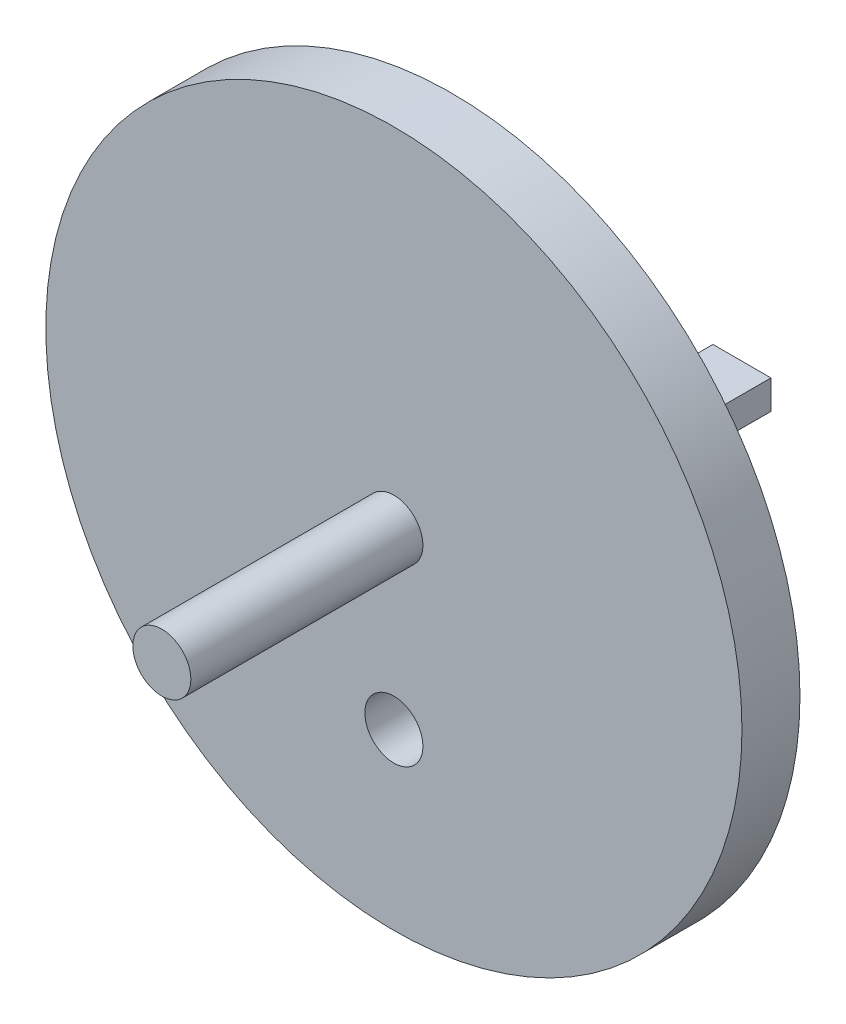
ISO-10303-21;
HEADER;
FILE_DESCRIPTION(('STEP AP214'),'2;1');
FILE_NAME('part.step','',(''),(''),'','','');
FILE_SCHEMA(('AUTOMOTIVE_DESIGN { 1 0 10303 214 1 1 1 1 }'));
ENDSEC;
DATA;
#1=APPLICATION_CONTEXT('core data for automotive mechanical design processes');
#2=APPLICATION_PROTOCOL_DEFINITION('international standard','automotive_design',2000,#1);
#3=PRODUCT_CONTEXT('',#1,'mechanical');
#4=PRODUCT('Part','Part','',(#3));
#5=PRODUCT_RELATED_PRODUCT_CATEGORY('part','',(#4));
#6=PRODUCT_DEFINITION_FORMATION('','',#4);
#7=PRODUCT_DEFINITION_CONTEXT('part definition',#1,'design');
#8=PRODUCT_DEFINITION('design','',#6,#7);
#9=PRODUCT_DEFINITION_SHAPE('','',#8);
#10=(LENGTH_UNIT() NAMED_UNIT(*) SI_UNIT(.MILLI.,.METRE.));
#11=(NAMED_UNIT(*) PLANE_ANGLE_UNIT() SI_UNIT($,.RADIAN.));
#12=(NAMED_UNIT(*) SI_UNIT($,.STERADIAN.) SOLID_ANGLE_UNIT());
#13=UNCERTAINTY_MEASURE_WITH_UNIT(LENGTH_MEASURE(1.E-05),#10,'distance_accuracy_value','');
#14=(GEOMETRIC_REPRESENTATION_CONTEXT(3) GLOBAL_UNCERTAINTY_ASSIGNED_CONTEXT((#13)) GLOBAL_UNIT_ASSIGNED_CONTEXT((#10,
#11,#12)) REPRESENTATION_CONTEXT('',''));
#15=CARTESIAN_POINT('',(0.,0.,0.));
#16=DIRECTION('',(0.,0.,1.));
#17=DIRECTION('',(1.,0.,0.));
#18=AXIS2_PLACEMENT_3D('',#15,#16,#17);
#19=CARTESIAN_POINT('',(0.,0.,0.));
#20=DIRECTION('',(0.,0.,1.));
#21=DIRECTION('',(1.,0.,0.));
#22=AXIS2_PLACEMENT_3D('',#19,#20,#21);
#23=PLANE('',#22);
#24=DIRECTION('',(0.,-1.,0.));
#25=VECTOR('',#24,1.);
#26=CARTESIAN_POINT('',(45.,35.,0.));
#27=LINE('',#26,#25);
#28=CARTESIAN_POINT('',(45.,35.,0.));
#29=VERTEX_POINT('',#28);
#30=CARTESIAN_POINT('',(45.,30.,0.));
#31=VERTEX_POINT('',#30);
#32=EDGE_CURVE('E123',#29,#31,#27,.T.);
#33=ORIENTED_EDGE('',*,*,#32,.F.);
#34=DIRECTION('',(1.,0.,0.));
#35=VECTOR('',#34,1.);
#36=CARTESIAN_POINT('',(45.,35.,0.));
#37=LINE('',#36,#35);
#38=CARTESIAN_POINT('',(35.,35.,0.));
#39=VERTEX_POINT('',#38);
#40=EDGE_CURVE('E136',#39,#29,#37,.T.);
#41=ORIENTED_EDGE('',*,*,#40,.F.);
#42=DIRECTION('',(0.,1.,0.));
#43=VECTOR('',#42,1.);
#44=CARTESIAN_POINT('',(35.,35.,0.));
#45=LINE('',#44,#43);
#46=CARTESIAN_POINT('',(35.,30.,0.));
#47=VERTEX_POINT('',#46);
#48=EDGE_CURVE('E145',#47,#39,#45,.T.);
#49=ORIENTED_EDGE('',*,*,#48,.F.);
#50=DIRECTION('',(-1.,0.,0.));
#51=VECTOR('',#50,1.);
#52=CARTESIAN_POINT('',(45.,30.,0.));
#53=LINE('',#52,#51);
#54=EDGE_CURVE('E126',#31,#47,#53,.T.);
#55=ORIENTED_EDGE('',*,*,#54,.F.);
#56=EDGE_LOOP('',(#33,#41,#49,#55));
#57=FACE_BOUND('',#56,.T.);
#58=CARTESIAN_POINT('',(0.,-30.,0.));
#59=DIRECTION('',(0.,0.,-1.));
#60=DIRECTION('',(-1.,0.,0.));
#61=AXIS2_PLACEMENT_3D('',#58,#59,#60);
#62=CIRCLE('',#61,5.);
#63=CARTESIAN_POINT('',(-5.00000000000001,-30.,0.));
#64=VERTEX_POINT('',#63);
#65=EDGE_CURVE('E161',#64,#64,#62,.T.);
#66=ORIENTED_EDGE('',*,*,#65,.F.);
#67=EDGE_LOOP('',(#66));
#68=FACE_BOUND('',#67,.T.);
#69=CARTESIAN_POINT('',(0.,0.,0.));
#70=DIRECTION('',(0.,0.,1.));
#71=DIRECTION('',(1.,0.,0.));
#72=AXIS2_PLACEMENT_3D('',#69,#70,#71);
#73=CIRCLE('',#72,60.);
#74=CARTESIAN_POINT('',(60.,0.,0.));
#75=VERTEX_POINT('',#74);
#76=EDGE_CURVE('E41',#75,#75,#73,.T.);
#77=ORIENTED_EDGE('',*,*,#76,.F.);
#78=EDGE_LOOP('',(#77));
#79=FACE_BOUND('',#78,.T.);
#80=DIRECTION('',(1.,0.,0.));
#81=VECTOR('',#80,1.);
#82=CARTESIAN_POINT('',(-45.,35.,0.));
#83=LINE('',#82,#81);
#84=CARTESIAN_POINT('',(-45.,35.,0.));
#85=VERTEX_POINT('',#84);
#86=CARTESIAN_POINT('',(-35.,35.,0.));
#87=VERTEX_POINT('',#86);
#88=EDGE_CURVE('E122',#85,#87,#83,.T.);
#89=ORIENTED_EDGE('',*,*,#88,.F.);
#90=DIRECTION('',(0.,1.,0.));
#91=VECTOR('',#90,1.);
#92=CARTESIAN_POINT('',(-45.,35.,0.));
#93=LINE('',#92,#91);
#94=CARTESIAN_POINT('',(-45.,30.,0.));
#95=VERTEX_POINT('',#94);
#96=EDGE_CURVE('E119',#95,#85,#93,.T.);
#97=ORIENTED_EDGE('',*,*,#96,.F.);
#98=DIRECTION('',(-1.,0.,0.));
#99=VECTOR('',#98,1.);
#100=CARTESIAN_POINT('',(-45.,30.,0.));
#101=LINE('',#100,#99);
#102=CARTESIAN_POINT('',(-35.,30.,0.));
#103=VERTEX_POINT('',#102);
#104=EDGE_CURVE('E57',#103,#95,#101,.T.);
#105=ORIENTED_EDGE('',*,*,#104,.F.);
#106=DIRECTION('',(0.,-1.,0.));
#107=VECTOR('',#106,1.);
#108=CARTESIAN_POINT('',(-35.,35.,0.));
#109=LINE('',#108,#107);
#110=EDGE_CURVE('E52',#87,#103,#109,.T.);
#111=ORIENTED_EDGE('',*,*,#110,.F.);
#112=EDGE_LOOP('',(#89,#97,#105,#111));
#113=FACE_BOUND('',#112,.T.);
#114=ADVANCED_FACE('F37',(#57,#68,#79,#113),#23,.F.);
#115=CARTESIAN_POINT('',(0.,0.,10.));
#116=DIRECTION('',(0.,0.,1.));
#117=DIRECTION('',(1.,0.,0.));
#118=AXIS2_PLACEMENT_3D('',#115,#116,#117);
#119=PLANE('',#118);
#120=CARTESIAN_POINT('',(0.,-30.,10.));
#121=DIRECTION('',(0.,0.,-1.));
#122=DIRECTION('',(-1.,0.,0.));
#123=AXIS2_PLACEMENT_3D('',#120,#121,#122);
#124=CIRCLE('',#123,5.);
#125=CARTESIAN_POINT('',(-5.00000000000001,-30.,10.));
#126=VERTEX_POINT('',#125);
#127=EDGE_CURVE('E162',#126,#126,#124,.T.);
#128=ORIENTED_EDGE('',*,*,#127,.T.);
#129=EDGE_LOOP('',(#128));
#130=FACE_BOUND('',#129,.T.);
#131=CARTESIAN_POINT('',(0.,0.,10.));
#132=DIRECTION('',(0.,0.,1.));
#133=DIRECTION('',(1.,0.,0.));
#134=AXIS2_PLACEMENT_3D('',#131,#132,#133);
#135=CIRCLE('',#134,60.);
#136=CARTESIAN_POINT('',(60.,0.,10.));
#137=VERTEX_POINT('',#136);
#138=EDGE_CURVE('E11',#137,#137,#135,.T.);
#139=ORIENTED_EDGE('',*,*,#138,.T.);
#140=EDGE_LOOP('',(#139));
#141=FACE_BOUND('',#140,.T.);
#142=CARTESIAN_POINT('',(0.,0.,10.));
#143=DIRECTION('',(0.,0.,1.));
#144=DIRECTION('',(1.,0.,0.));
#145=AXIS2_PLACEMENT_3D('',#142,#143,#144);
#146=CIRCLE('',#145,5.);
#147=CARTESIAN_POINT('',(5.,0.,10.));
#148=VERTEX_POINT('',#147);
#149=EDGE_CURVE('E165',#148,#148,#146,.T.);
#150=ORIENTED_EDGE('',*,*,#149,.F.);
#151=EDGE_LOOP('',(#150));
#152=FACE_BOUND('',#151,.T.);
#153=ADVANCED_FACE('F176',(#130,#141,#152),#119,.T.);
#154=CARTESIAN_POINT('',(0.,0.,10.));
#155=DIRECTION('',(0.,0.,-1.));
#156=DIRECTION('',(-1.,0.,0.));
#157=AXIS2_PLACEMENT_3D('',#154,#155,#156);
#158=CYLINDRICAL_SURFACE('',#157,60.);
#159=ORIENTED_EDGE('',*,*,#138,.F.);
#160=EDGE_LOOP('',(#159));
#161=FACE_BOUND('',#160,.T.);
#162=ORIENTED_EDGE('',*,*,#76,.T.);
#163=EDGE_LOOP('',(#162));
#164=FACE_BOUND('',#163,.T.);
#165=ADVANCED_FACE('F39',(#161,#164),#158,.T.);
#166=CARTESIAN_POINT('',(0.,0.,50.));
#167=DIRECTION('',(0.,0.,-1.));
#168=DIRECTION('',(-1.,0.,0.));
#169=AXIS2_PLACEMENT_3D('',#166,#167,#168);
#170=CYLINDRICAL_SURFACE('',#169,5.);
#171=CARTESIAN_POINT('',(0.,0.,50.));
#172=DIRECTION('',(0.,0.,1.));
#173=DIRECTION('',(1.,0.,0.));
#174=AXIS2_PLACEMENT_3D('',#171,#172,#173);
#175=CIRCLE('',#174,5.);
#176=CARTESIAN_POINT('',(5.,0.,50.));
#177=VERTEX_POINT('',#176);
#178=EDGE_CURVE('E168',#177,#177,#175,.T.);
#179=ORIENTED_EDGE('',*,*,#178,.F.);
#180=EDGE_LOOP('',(#179));
#181=FACE_BOUND('',#180,.T.);
#182=ORIENTED_EDGE('',*,*,#149,.T.);
#183=EDGE_LOOP('',(#182));
#184=FACE_BOUND('',#183,.T.);
#185=ADVANCED_FACE('F174',(#181,#184),#170,.T.);
#186=CARTESIAN_POINT('',(0.,0.,50.));
#187=DIRECTION('',(0.,0.,1.));
#188=DIRECTION('',(1.,0.,0.));
#189=AXIS2_PLACEMENT_3D('',#186,#187,#188);
#190=PLANE('',#189);
#191=ORIENTED_EDGE('',*,*,#178,.T.);
#192=EDGE_LOOP('',(#191));
#193=FACE_BOUND('',#192,.T.);
#194=ADVANCED_FACE('F190',(#193),#190,.T.);
#195=CARTESIAN_POINT('',(0.,-30.,10.));
#196=DIRECTION('',(0.,0.,-1.));
#197=DIRECTION('',(-1.,0.,0.));
#198=AXIS2_PLACEMENT_3D('',#195,#196,#197);
#199=CYLINDRICAL_SURFACE('',#198,5.);
#200=ORIENTED_EDGE('',*,*,#127,.F.);
#201=EDGE_LOOP('',(#200));
#202=FACE_BOUND('',#201,.T.);
#203=ORIENTED_EDGE('',*,*,#65,.T.);
#204=EDGE_LOOP('',(#203));
#205=FACE_BOUND('',#204,.T.);
#206=ADVANCED_FACE('F194',(#202,#205),#199,.F.);
#207=CARTESIAN_POINT('',(45.,35.,-10.));
#208=DIRECTION('',(-1.,0.,0.));
#209=DIRECTION('',(0.,-1.,0.));
#210=AXIS2_PLACEMENT_3D('',#207,#208,#209);
#211=PLANE('',#210);
#212=ORIENTED_EDGE('',*,*,#32,.T.);
#213=DIRECTION('',(0.,0.,1.));
#214=VECTOR('',#213,1.);
#215=CARTESIAN_POINT('',(45.,30.,-10.));
#216=LINE('',#215,#214);
#217=CARTESIAN_POINT('',(45.,30.,-10.));
#218=VERTEX_POINT('',#217);
#219=EDGE_CURVE('E158',#218,#31,#216,.T.);
#220=ORIENTED_EDGE('',*,*,#219,.F.);
#221=DIRECTION('',(0.,-1.,0.));
#222=VECTOR('',#221,1.);
#223=CARTESIAN_POINT('',(45.,35.,-10.));
#224=LINE('',#223,#222);
#225=CARTESIAN_POINT('',(45.,35.,-10.));
#226=VERTEX_POINT('',#225);
#227=EDGE_CURVE('E132',#226,#218,#224,.T.);
#228=ORIENTED_EDGE('',*,*,#227,.F.);
#229=DIRECTION('',(0.,0.,1.));
#230=VECTOR('',#229,1.);
#231=CARTESIAN_POINT('',(45.,35.,-10.));
#232=LINE('',#231,#230);
#233=EDGE_CURVE('E141',#226,#29,#232,.T.);
#234=ORIENTED_EDGE('',*,*,#233,.T.);
#235=EDGE_LOOP('',(#212,#220,#228,#234));
#236=FACE_BOUND('',#235,.T.);
#237=ADVANCED_FACE('F198',(#236),#211,.F.);
#238=CARTESIAN_POINT('',(45.,30.,-10.));
#239=DIRECTION('',(0.,1.,0.));
#240=DIRECTION('',(-1.,0.,0.));
#241=AXIS2_PLACEMENT_3D('',#238,#239,#240);
#242=PLANE('',#241);
#243=ORIENTED_EDGE('',*,*,#54,.T.);
#244=DIRECTION('',(0.,0.,1.));
#245=VECTOR('',#244,1.);
#246=CARTESIAN_POINT('',(35.,30.,-10.));
#247=LINE('',#246,#245);
#248=CARTESIAN_POINT('',(35.,30.,-10.));
#249=VERTEX_POINT('',#248);
#250=EDGE_CURVE('E155',#249,#47,#247,.T.);
#251=ORIENTED_EDGE('',*,*,#250,.F.);
#252=DIRECTION('',(-1.,0.,0.));
#253=VECTOR('',#252,1.);
#254=CARTESIAN_POINT('',(45.,30.,-10.));
#255=LINE('',#254,#253);
#256=EDGE_CURVE('E135',#218,#249,#255,.T.);
#257=ORIENTED_EDGE('',*,*,#256,.F.);
#258=ORIENTED_EDGE('',*,*,#219,.T.);
#259=EDGE_LOOP('',(#243,#251,#257,#258));
#260=FACE_BOUND('',#259,.T.);
#261=ADVANCED_FACE('F202',(#260),#242,.F.);
#262=CARTESIAN_POINT('',(35.,35.,-10.));
#263=DIRECTION('',(1.,0.,0.));
#264=DIRECTION('',(0.,0.,-1.));
#265=AXIS2_PLACEMENT_3D('',#262,#263,#264);
#266=PLANE('',#265);
#267=ORIENTED_EDGE('',*,*,#48,.T.);
#268=DIRECTION('',(0.,0.,1.));
#269=VECTOR('',#268,1.);
#270=CARTESIAN_POINT('',(35.,35.,-10.));
#271=LINE('',#270,#269);
#272=CARTESIAN_POINT('',(35.,35.,-10.));
#273=VERTEX_POINT('',#272);
#274=EDGE_CURVE('E152',#273,#39,#271,.T.);
#275=ORIENTED_EDGE('',*,*,#274,.F.);
#276=DIRECTION('',(0.,1.,0.));
#277=VECTOR('',#276,1.);
#278=CARTESIAN_POINT('',(35.,35.,-10.));
#279=LINE('',#278,#277);
#280=EDGE_CURVE('E138',#249,#273,#279,.T.);
#281=ORIENTED_EDGE('',*,*,#280,.F.);
#282=ORIENTED_EDGE('',*,*,#250,.T.);
#283=EDGE_LOOP('',(#267,#275,#281,#282));
#284=FACE_BOUND('',#283,.T.);
#285=ADVANCED_FACE('F206',(#284),#266,.F.);
#286=CARTESIAN_POINT('',(45.,35.,-10.));
#287=DIRECTION('',(0.,-1.,0.));
#288=DIRECTION('',(1.,0.,0.));
#289=AXIS2_PLACEMENT_3D('',#286,#287,#288);
#290=PLANE('',#289);
#291=ORIENTED_EDGE('',*,*,#40,.T.);
#292=ORIENTED_EDGE('',*,*,#233,.F.);
#293=DIRECTION('',(1.,0.,0.));
#294=VECTOR('',#293,1.);
#295=CARTESIAN_POINT('',(45.,35.,-10.));
#296=LINE('',#295,#294);
#297=EDGE_CURVE('E140',#273,#226,#296,.T.);
#298=ORIENTED_EDGE('',*,*,#297,.F.);
#299=ORIENTED_EDGE('',*,*,#274,.T.);
#300=EDGE_LOOP('',(#291,#292,#298,#299));
#301=FACE_BOUND('',#300,.T.);
#302=ADVANCED_FACE('F210',(#301),#290,.F.);
#303=CARTESIAN_POINT('',(0.,0.,-10.));
#304=DIRECTION('',(0.,0.,-1.));
#305=DIRECTION('',(-1.,0.,0.));
#306=AXIS2_PLACEMENT_3D('',#303,#304,#305);
#307=PLANE('',#306);
#308=ORIENTED_EDGE('',*,*,#227,.T.);
#309=ORIENTED_EDGE('',*,*,#256,.T.);
#310=ORIENTED_EDGE('',*,*,#280,.T.);
#311=ORIENTED_EDGE('',*,*,#297,.T.);
#312=EDGE_LOOP('',(#308,#309,#310,#311));
#313=FACE_BOUND('',#312,.T.);
#314=ADVANCED_FACE('F214',(#313),#307,.T.);
#315=CARTESIAN_POINT('',(-45.,35.,-10.));
#316=DIRECTION('',(0.,-1.,0.));
#317=DIRECTION('',(1.,0.,0.));
#318=AXIS2_PLACEMENT_3D('',#315,#316,#317);
#319=PLANE('',#318);
#320=ORIENTED_EDGE('',*,*,#88,.T.);
#321=DIRECTION('',(0.,0.,1.));
#322=VECTOR('',#321,1.);
#323=CARTESIAN_POINT('',(-35.,35.,-10.));
#324=LINE('',#323,#322);
#325=CARTESIAN_POINT('',(-35.,35.,-10.));
#326=VERTEX_POINT('',#325);
#327=EDGE_CURVE('E103',#326,#87,#324,.T.);
#328=ORIENTED_EDGE('',*,*,#327,.F.);
#329=DIRECTION('',(1.,0.,0.));
#330=VECTOR('',#329,1.);
#331=CARTESIAN_POINT('',(-45.,35.,-10.));
#332=LINE('',#331,#330);
#333=CARTESIAN_POINT('',(-45.,35.,-10.));
#334=VERTEX_POINT('',#333);
#335=EDGE_CURVE('E110',#334,#326,#332,.T.);
#336=ORIENTED_EDGE('',*,*,#335,.F.);
#337=DIRECTION('',(0.,0.,1.));
#338=VECTOR('',#337,1.);
#339=CARTESIAN_POINT('',(-45.,35.,-10.));
#340=LINE('',#339,#338);
#341=EDGE_CURVE('E328',#334,#85,#340,.T.);
#342=ORIENTED_EDGE('',*,*,#341,.T.);
#343=EDGE_LOOP('',(#320,#328,#336,#342));
#344=FACE_BOUND('',#343,.T.);
#345=ADVANCED_FACE('F121',(#344),#319,.F.);
#346=CARTESIAN_POINT('',(-35.,35.,-10.));
#347=DIRECTION('',(-1.,0.,0.));
#348=DIRECTION('',(0.,0.,1.));
#349=AXIS2_PLACEMENT_3D('',#346,#347,#348);
#350=PLANE('',#349);
#351=ORIENTED_EDGE('',*,*,#110,.T.);
#352=DIRECTION('',(0.,0.,1.));
#353=VECTOR('',#352,1.);
#354=CARTESIAN_POINT('',(-35.,30.,-10.));
#355=LINE('',#354,#353);
#356=CARTESIAN_POINT('',(-35.,30.,-10.));
#357=VERTEX_POINT('',#356);
#358=EDGE_CURVE('E106',#357,#103,#355,.T.);
#359=ORIENTED_EDGE('',*,*,#358,.F.);
#360=DIRECTION('',(0.,-1.,0.));
#361=VECTOR('',#360,1.);
#362=CARTESIAN_POINT('',(-35.,35.,-10.));
#363=LINE('',#362,#361);
#364=EDGE_CURVE('E99',#326,#357,#363,.T.);
#365=ORIENTED_EDGE('',*,*,#364,.F.);
#366=ORIENTED_EDGE('',*,*,#327,.T.);
#367=EDGE_LOOP('',(#351,#359,#365,#366));
#368=FACE_BOUND('',#367,.T.);
#369=ADVANCED_FACE('F101',(#368),#350,.F.);
#370=CARTESIAN_POINT('',(-45.,30.,-10.));
#371=DIRECTION('',(0.,1.,0.));
#372=DIRECTION('',(-1.,0.,0.));
#373=AXIS2_PLACEMENT_3D('',#370,#371,#372);
#374=PLANE('',#373);
#375=ORIENTED_EDGE('',*,*,#104,.T.);
#376=DIRECTION('',(0.,0.,1.));
#377=VECTOR('',#376,1.);
#378=CARTESIAN_POINT('',(-45.,30.,-10.));
#379=LINE('',#378,#377);
#380=CARTESIAN_POINT('',(-45.,30.,-10.));
#381=VERTEX_POINT('',#380);
#382=EDGE_CURVE('E128',#381,#95,#379,.T.);
#383=ORIENTED_EDGE('',*,*,#382,.F.);
#384=DIRECTION('',(-1.,0.,0.));
#385=VECTOR('',#384,1.);
#386=CARTESIAN_POINT('',(-45.,30.,-10.));
#387=LINE('',#386,#385);
#388=EDGE_CURVE('E109',#357,#381,#387,.T.);
#389=ORIENTED_EDGE('',*,*,#388,.F.);
#390=ORIENTED_EDGE('',*,*,#358,.T.);
#391=EDGE_LOOP('',(#375,#383,#389,#390));
#392=FACE_BOUND('',#391,.T.);
#393=ADVANCED_FACE('F223',(#392),#374,.F.);
#394=CARTESIAN_POINT('',(-45.,35.,-10.));
#395=DIRECTION('',(1.,0.,0.));
#396=DIRECTION('',(0.,1.,0.));
#397=AXIS2_PLACEMENT_3D('',#394,#395,#396);
#398=PLANE('',#397);
#399=ORIENTED_EDGE('',*,*,#96,.T.);
#400=ORIENTED_EDGE('',*,*,#341,.F.);
#401=DIRECTION('',(0.,1.,0.));
#402=VECTOR('',#401,1.);
#403=CARTESIAN_POINT('',(-45.,35.,-10.));
#404=LINE('',#403,#402);
#405=EDGE_CURVE('E115',#381,#334,#404,.T.);
#406=ORIENTED_EDGE('',*,*,#405,.F.);
#407=ORIENTED_EDGE('',*,*,#382,.T.);
#408=EDGE_LOOP('',(#399,#400,#406,#407));
#409=FACE_BOUND('',#408,.T.);
#410=ADVANCED_FACE('F226',(#409),#398,.F.);
#411=CARTESIAN_POINT('',(0.,0.,-10.));
#412=DIRECTION('',(0.,0.,-1.));
#413=DIRECTION('',(-1.,0.,0.));
#414=AXIS2_PLACEMENT_3D('',#411,#412,#413);
#415=PLANE('',#414);
#416=ORIENTED_EDGE('',*,*,#335,.T.);
#417=ORIENTED_EDGE('',*,*,#364,.T.);
#418=ORIENTED_EDGE('',*,*,#388,.T.);
#419=ORIENTED_EDGE('',*,*,#405,.T.);
#420=EDGE_LOOP('',(#416,#417,#418,#419));
#421=FACE_BOUND('',#420,.T.);
#422=ADVANCED_FACE('F113',(#421),#415,.T.);
#423=CLOSED_SHELL('',(#114,#153,#165,#185,#194,#206,#237,#261,#285,#302,#314,#345,#369,#393,
#410,#422));
#424=MANIFOLD_SOLID_BREP('B2',#423);
#425=ADVANCED_BREP_SHAPE_REPRESENTATION('',(#18,#424),#14);
#426=SHAPE_DEFINITION_REPRESENTATION(#9,#425);
ENDSEC;
END-ISO-10303-21;
